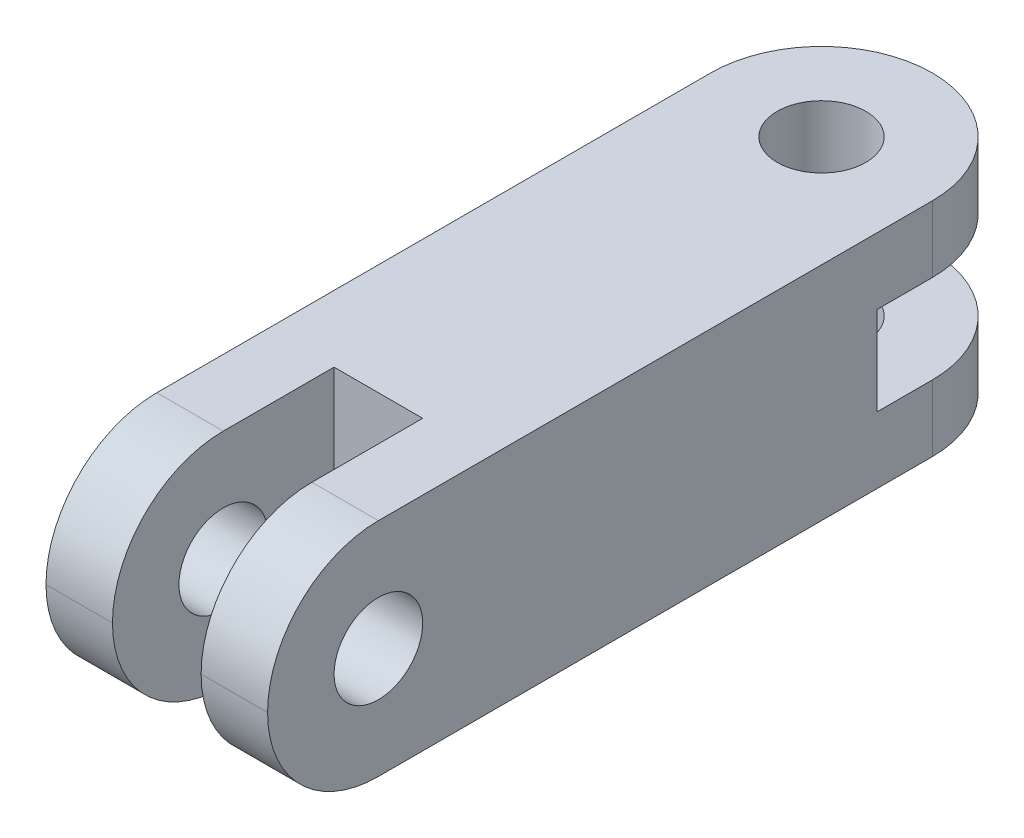
ISO-10303-21;
HEADER;
FILE_DESCRIPTION(('STEP AP214'),'2;1');
FILE_NAME('part.step','',(''),(''),'','','');
FILE_SCHEMA(('AUTOMOTIVE_DESIGN { 1 0 10303 214 1 1 1 1 }'));
ENDSEC;
DATA;
#1=APPLICATION_CONTEXT('core data for automotive mechanical design processes');
#2=APPLICATION_PROTOCOL_DEFINITION('international standard','automotive_design',2000,#1);
#3=PRODUCT_CONTEXT('',#1,'mechanical');
#4=PRODUCT('Part','Part','',(#3));
#5=PRODUCT_RELATED_PRODUCT_CATEGORY('part','',(#4));
#6=PRODUCT_DEFINITION_FORMATION('','',#4);
#7=PRODUCT_DEFINITION_CONTEXT('part definition',#1,'design');
#8=PRODUCT_DEFINITION('design','',#6,#7);
#9=PRODUCT_DEFINITION_SHAPE('','',#8);
#10=(LENGTH_UNIT() NAMED_UNIT(*) SI_UNIT(.MILLI.,.METRE.));
#11=(NAMED_UNIT(*) PLANE_ANGLE_UNIT() SI_UNIT($,.RADIAN.));
#12=(NAMED_UNIT(*) SI_UNIT($,.STERADIAN.) SOLID_ANGLE_UNIT());
#13=UNCERTAINTY_MEASURE_WITH_UNIT(LENGTH_MEASURE(1.E-05),#10,'distance_accuracy_value','');
#14=(GEOMETRIC_REPRESENTATION_CONTEXT(3) GLOBAL_UNCERTAINTY_ASSIGNED_CONTEXT((#13)) GLOBAL_UNIT_ASSIGNED_CONTEXT((#10,
#11,#12)) REPRESENTATION_CONTEXT('',''));
#15=CARTESIAN_POINT('',(0.,0.,0.));
#16=DIRECTION('',(0.,0.,1.));
#17=DIRECTION('',(1.,0.,0.));
#18=AXIS2_PLACEMENT_3D('',#15,#16,#17);
#19=CARTESIAN_POINT('',(25.,0.,0.));
#20=DIRECTION('',(1.,0.,0.));
#21=DIRECTION('',(0.,0.,-1.));
#22=AXIS2_PLACEMENT_3D('',#19,#20,#21);
#23=PLANE('',#22);
#24=DIRECTION('',(0.,0.,1.));
#25=VECTOR('',#24,1.);
#26=CARTESIAN_POINT('',(25.,10.,0.));
#27=LINE('',#26,#25);
#28=CARTESIAN_POINT('',(25.,10.,-62.5));
#29=VERTEX_POINT('',#28);
#30=CARTESIAN_POINT('',(25.,10.,-50.));
#31=VERTEX_POINT('',#30);
#32=EDGE_CURVE('E248',#29,#31,#27,.T.);
#33=ORIENTED_EDGE('',*,*,#32,.F.);
#34=DIRECTION('',(0.,1.,0.));
#35=VECTOR('',#34,1.);
#36=CARTESIAN_POINT('',(25.,0.,-62.5));
#37=LINE('',#36,#35);
#38=CARTESIAN_POINT('',(25.,25.,-62.5));
#39=VERTEX_POINT('',#38);
#40=EDGE_CURVE('E257',#29,#39,#37,.T.);
#41=ORIENTED_EDGE('',*,*,#40,.T.);
#42=DIRECTION('',(0.,0.,1.));
#43=VECTOR('',#42,1.);
#44=CARTESIAN_POINT('',(25.,25.,-87.5));
#45=LINE('',#44,#43);
#46=CARTESIAN_POINT('',(25.,25.,62.5));
#47=VERTEX_POINT('',#46);
#48=EDGE_CURVE('E210',#39,#47,#45,.T.);
#49=ORIENTED_EDGE('',*,*,#48,.T.);
#50=CARTESIAN_POINT('',(25.,0.,62.5));
#51=DIRECTION('',(1.,0.,0.));
#52=DIRECTION('',(0.,0.,-1.));
#53=AXIS2_PLACEMENT_3D('',#50,#51,#52);
#54=CIRCLE('',#53,25.);
#55=CARTESIAN_POINT('',(25.,0.,87.5));
#56=VERTEX_POINT('',#55);
#57=EDGE_CURVE('E238',#47,#56,#54,.T.);
#58=ORIENTED_EDGE('',*,*,#57,.T.);
#59=CARTESIAN_POINT('',(25.,0.,62.5));
#60=DIRECTION('',(1.,0.,0.));
#61=DIRECTION('',(0.,0.,-1.));
#62=AXIS2_PLACEMENT_3D('',#59,#60,#61);
#63=CIRCLE('',#62,25.);
#64=CARTESIAN_POINT('',(25.,-25.,62.5));
#65=VERTEX_POINT('',#64);
#66=EDGE_CURVE('E236',#56,#65,#63,.T.);
#67=ORIENTED_EDGE('',*,*,#66,.T.);
#68=DIRECTION('',(0.,0.,-1.));
#69=VECTOR('',#68,1.);
#70=CARTESIAN_POINT('',(25.,-25.,87.5));
#71=LINE('',#70,#69);
#72=CARTESIAN_POINT('',(25.,-25.,-62.5));
#73=VERTEX_POINT('',#72);
#74=EDGE_CURVE('E214',#65,#73,#71,.T.);
#75=ORIENTED_EDGE('',*,*,#74,.T.);
#76=DIRECTION('',(0.,1.,0.));
#77=VECTOR('',#76,1.);
#78=CARTESIAN_POINT('',(25.,0.,-62.5));
#79=LINE('',#78,#77);
#80=CARTESIAN_POINT('',(25.,-10.,-62.5));
#81=VERTEX_POINT('',#80);
#82=EDGE_CURVE('E254',#73,#81,#79,.T.);
#83=ORIENTED_EDGE('',*,*,#82,.T.);
#84=DIRECTION('',(0.,0.,-1.));
#85=VECTOR('',#84,1.);
#86=CARTESIAN_POINT('',(25.,-10.,-50.));
#87=LINE('',#86,#85);
#88=CARTESIAN_POINT('',(25.,-10.,-50.));
#89=VERTEX_POINT('',#88);
#90=EDGE_CURVE('E178',#89,#81,#87,.T.);
#91=ORIENTED_EDGE('',*,*,#90,.F.);
#92=DIRECTION('',(0.,-1.,0.));
#93=VECTOR('',#92,1.);
#94=CARTESIAN_POINT('',(25.,10.,-50.));
#95=LINE('',#94,#93);
#96=EDGE_CURVE('E163',#31,#89,#95,.T.);
#97=ORIENTED_EDGE('',*,*,#96,.F.);
#98=EDGE_LOOP('',(#33,#41,#49,#58,#67,#75,#83,#91,#97));
#99=FACE_BOUND('',#98,.T.);
#100=CARTESIAN_POINT('',(25.,0.,62.5));
#101=DIRECTION('',(-1.,0.,0.));
#102=DIRECTION('',(0.,0.,1.));
#103=AXIS2_PLACEMENT_3D('',#100,#101,#102);
#104=CIRCLE('',#103,10.);
#105=CARTESIAN_POINT('',(25.,0.,72.5));
#106=VERTEX_POINT('',#105);
#107=EDGE_CURVE('E297',#106,#106,#104,.T.);
#108=ORIENTED_EDGE('',*,*,#107,.T.);
#109=EDGE_LOOP('',(#108));
#110=FACE_BOUND('',#109,.T.);
#111=ADVANCED_FACE('F41',(#99,#110),#23,.T.);
#112=CARTESIAN_POINT('',(-25.,25.,-87.5));
#113=DIRECTION('',(0.,1.,0.));
#114=DIRECTION('',(0.,0.,1.));
#115=AXIS2_PLACEMENT_3D('',#112,#113,#114);
#116=PLANE('',#115);
#117=CARTESIAN_POINT('',(0.,25.,-62.5));
#118=DIRECTION('',(0.,1.,0.));
#119=DIRECTION('',(0.,0.,1.));
#120=AXIS2_PLACEMENT_3D('',#117,#118,#119);
#121=CIRCLE('',#120,10.);
#122=CARTESIAN_POINT('',(0.,25.,-52.5));
#123=VERTEX_POINT('',#122);
#124=EDGE_CURVE('E289',#123,#123,#121,.T.);
#125=ORIENTED_EDGE('',*,*,#124,.F.);
#126=EDGE_LOOP('',(#125));
#127=FACE_BOUND('',#126,.T.);
#128=ORIENTED_EDGE('',*,*,#48,.F.);
#129=CARTESIAN_POINT('',(0.,25.,-62.5));
#130=DIRECTION('',(0.,1.,0.));
#131=DIRECTION('',(0.,0.,1.));
#132=AXIS2_PLACEMENT_3D('',#129,#130,#131);
#133=CIRCLE('',#132,25.);
#134=CARTESIAN_POINT('',(0.,25.,-87.5));
#135=VERTEX_POINT('',#134);
#136=EDGE_CURVE('E262',#39,#135,#133,.T.);
#137=ORIENTED_EDGE('',*,*,#136,.T.);
#138=CARTESIAN_POINT('',(0.,25.,-62.5));
#139=DIRECTION('',(0.,1.,0.));
#140=DIRECTION('',(0.,0.,1.));
#141=AXIS2_PLACEMENT_3D('',#138,#139,#140);
#142=CIRCLE('',#141,25.);
#143=CARTESIAN_POINT('',(-25.,25.,-62.5));
#144=VERTEX_POINT('',#143);
#145=EDGE_CURVE('E260',#135,#144,#142,.T.);
#146=ORIENTED_EDGE('',*,*,#145,.T.);
#147=DIRECTION('',(0.,0.,1.));
#148=VECTOR('',#147,1.);
#149=CARTESIAN_POINT('',(-25.,25.,-87.5));
#150=LINE('',#149,#148);
#151=CARTESIAN_POINT('',(-25.,25.,62.5));
#152=VERTEX_POINT('',#151);
#153=EDGE_CURVE('E217',#144,#152,#150,.T.);
#154=ORIENTED_EDGE('',*,*,#153,.T.);
#155=DIRECTION('',(1.,0.,0.));
#156=VECTOR('',#155,1.);
#157=CARTESIAN_POINT('',(-25.,25.,62.5));
#158=LINE('',#157,#156);
#159=CARTESIAN_POINT('',(-10.,25.,62.5));
#160=VERTEX_POINT('',#159);
#161=EDGE_CURVE('E224',#152,#160,#158,.T.);
#162=ORIENTED_EDGE('',*,*,#161,.T.);
#163=DIRECTION('',(0.,0.,1.));
#164=VECTOR('',#163,1.);
#165=CARTESIAN_POINT('',(-10.,25.,87.5));
#166=LINE('',#165,#164);
#167=CARTESIAN_POINT('',(-10.,25.,37.5));
#168=VERTEX_POINT('',#167);
#169=EDGE_CURVE('E200',#168,#160,#166,.T.);
#170=ORIENTED_EDGE('',*,*,#169,.F.);
#171=DIRECTION('',(-1.,0.,0.));
#172=VECTOR('',#171,1.);
#173=CARTESIAN_POINT('',(-10.,25.,37.5));
#174=LINE('',#173,#172);
#175=CARTESIAN_POINT('',(10.,25.,37.5));
#176=VERTEX_POINT('',#175);
#177=EDGE_CURVE('E194',#176,#168,#174,.T.);
#178=ORIENTED_EDGE('',*,*,#177,.F.);
#179=DIRECTION('',(0.,0.,-1.));
#180=VECTOR('',#179,1.);
#181=CARTESIAN_POINT('',(10.,25.,87.5));
#182=LINE('',#181,#180);
#183=CARTESIAN_POINT('',(10.,25.,62.5));
#184=VERTEX_POINT('',#183);
#185=EDGE_CURVE('E203',#184,#176,#182,.T.);
#186=ORIENTED_EDGE('',*,*,#185,.F.);
#187=DIRECTION('',(1.,0.,0.));
#188=VECTOR('',#187,1.);
#189=CARTESIAN_POINT('',(-25.,25.,62.5));
#190=LINE('',#189,#188);
#191=EDGE_CURVE('E221',#184,#47,#190,.T.);
#192=ORIENTED_EDGE('',*,*,#191,.T.);
#193=EDGE_LOOP('',(#128,#137,#146,#154,#162,#170,#178,#186,#192));
#194=FACE_BOUND('',#193,.T.);
#195=ADVANCED_FACE('F319',(#127,#194),#116,.T.);
#196=CARTESIAN_POINT('',(-25.,-25.,87.5));
#197=DIRECTION('',(0.,-1.,0.));
#198=DIRECTION('',(0.,0.,-1.));
#199=AXIS2_PLACEMENT_3D('',#196,#197,#198);
#200=PLANE('',#199);
#201=CARTESIAN_POINT('',(0.,-25.,-62.5));
#202=DIRECTION('',(0.,1.,0.));
#203=DIRECTION('',(0.,0.,1.));
#204=AXIS2_PLACEMENT_3D('',#201,#202,#203);
#205=CIRCLE('',#204,10.);
#206=CARTESIAN_POINT('',(0.,-25.,-52.5));
#207=VERTEX_POINT('',#206);
#208=EDGE_CURVE('E285',#207,#207,#205,.T.);
#209=ORIENTED_EDGE('',*,*,#208,.T.);
#210=EDGE_LOOP('',(#209));
#211=FACE_BOUND('',#210,.T.);
#212=CARTESIAN_POINT('',(0.,-25.,-62.5));
#213=DIRECTION('',(0.,-1.,0.));
#214=DIRECTION('',(0.,0.,-1.));
#215=AXIS2_PLACEMENT_3D('',#212,#213,#214);
#216=CIRCLE('',#215,25.);
#217=CARTESIAN_POINT('',(-25.,-25.,-62.5));
#218=VERTEX_POINT('',#217);
#219=CARTESIAN_POINT('',(0.,-25.,-87.5));
#220=VERTEX_POINT('',#219);
#221=EDGE_CURVE('E58',#218,#220,#216,.T.);
#222=ORIENTED_EDGE('',*,*,#221,.T.);
#223=CARTESIAN_POINT('',(0.,-25.,-62.5));
#224=DIRECTION('',(0.,-1.,0.));
#225=DIRECTION('',(0.,0.,-1.));
#226=AXIS2_PLACEMENT_3D('',#223,#224,#225);
#227=CIRCLE('',#226,25.);
#228=EDGE_CURVE('E272',#220,#73,#227,.T.);
#229=ORIENTED_EDGE('',*,*,#228,.T.);
#230=ORIENTED_EDGE('',*,*,#74,.F.);
#231=DIRECTION('',(1.,0.,0.));
#232=VECTOR('',#231,1.);
#233=CARTESIAN_POINT('',(-25.,-25.,62.5));
#234=LINE('',#233,#232);
#235=CARTESIAN_POINT('',(10.,-25.,62.5));
#236=VERTEX_POINT('',#235);
#237=EDGE_CURVE('E244',#65,#236,#234,.F.);
#238=ORIENTED_EDGE('',*,*,#237,.T.);
#239=DIRECTION('',(0.,0.,-1.));
#240=VECTOR('',#239,1.);
#241=CARTESIAN_POINT('',(10.,-25.,87.5));
#242=LINE('',#241,#240);
#243=CARTESIAN_POINT('',(10.,-25.,37.5));
#244=VERTEX_POINT('',#243);
#245=EDGE_CURVE('E193',#236,#244,#242,.T.);
#246=ORIENTED_EDGE('',*,*,#245,.T.);
#247=DIRECTION('',(-1.,0.,0.));
#248=VECTOR('',#247,1.);
#249=CARTESIAN_POINT('',(-10.,-25.,37.5));
#250=LINE('',#249,#248);
#251=CARTESIAN_POINT('',(-10.,-25.,37.5));
#252=VERTEX_POINT('',#251);
#253=EDGE_CURVE('E196',#244,#252,#250,.T.);
#254=ORIENTED_EDGE('',*,*,#253,.T.);
#255=DIRECTION('',(0.,0.,1.));
#256=VECTOR('',#255,1.);
#257=CARTESIAN_POINT('',(-10.,-25.,87.5));
#258=LINE('',#257,#256);
#259=CARTESIAN_POINT('',(-10.,-25.,62.5));
#260=VERTEX_POINT('',#259);
#261=EDGE_CURVE('E190',#252,#260,#258,.T.);
#262=ORIENTED_EDGE('',*,*,#261,.T.);
#263=DIRECTION('',(1.,0.,0.));
#264=VECTOR('',#263,1.);
#265=CARTESIAN_POINT('',(-25.,-25.,62.5));
#266=LINE('',#265,#264);
#267=CARTESIAN_POINT('',(-25.,-25.,62.5));
#268=VERTEX_POINT('',#267);
#269=EDGE_CURVE('E246',#260,#268,#266,.F.);
#270=ORIENTED_EDGE('',*,*,#269,.T.);
#271=DIRECTION('',(0.,0.,-1.));
#272=VECTOR('',#271,1.);
#273=CARTESIAN_POINT('',(-25.,-25.,87.5));
#274=LINE('',#273,#272);
#275=EDGE_CURVE('E219',#268,#218,#274,.T.);
#276=ORIENTED_EDGE('',*,*,#275,.T.);
#277=EDGE_LOOP('',(#222,#229,#230,#238,#246,#254,#262,#270,#276));
#278=FACE_BOUND('',#277,.T.);
#279=ADVANCED_FACE('F309',(#211,#278),#200,.T.);
#280=CARTESIAN_POINT('',(-25.,0.,0.));
#281=DIRECTION('',(1.,0.,0.));
#282=DIRECTION('',(0.,0.,-1.));
#283=AXIS2_PLACEMENT_3D('',#280,#281,#282);
#284=PLANE('',#283);
#285=CARTESIAN_POINT('',(-25.,0.,62.5));
#286=DIRECTION('',(-1.,0.,0.));
#287=DIRECTION('',(0.,0.,1.));
#288=AXIS2_PLACEMENT_3D('',#285,#286,#287);
#289=CIRCLE('',#288,10.);
#290=CARTESIAN_POINT('',(-25.,0.,72.5));
#291=VERTEX_POINT('',#290);
#292=EDGE_CURVE('E300',#291,#291,#289,.T.);
#293=ORIENTED_EDGE('',*,*,#292,.F.);
#294=EDGE_LOOP('',(#293));
#295=FACE_BOUND('',#294,.T.);
#296=DIRECTION('',(0.,0.,-1.));
#297=VECTOR('',#296,1.);
#298=CARTESIAN_POINT('',(-25.,-10.,-50.));
#299=LINE('',#298,#297);
#300=CARTESIAN_POINT('',(-25.,-10.,-50.));
#301=VERTEX_POINT('',#300);
#302=CARTESIAN_POINT('',(-25.,-10.,-62.5));
#303=VERTEX_POINT('',#302);
#304=EDGE_CURVE('E170',#301,#303,#299,.T.);
#305=ORIENTED_EDGE('',*,*,#304,.T.);
#306=DIRECTION('',(0.,1.,0.));
#307=VECTOR('',#306,1.);
#308=CARTESIAN_POINT('',(-25.,-25.,-62.5));
#309=LINE('',#308,#307);
#310=EDGE_CURVE('E11',#303,#218,#309,.F.);
#311=ORIENTED_EDGE('',*,*,#310,.T.);
#312=ORIENTED_EDGE('',*,*,#275,.F.);
#313=CARTESIAN_POINT('',(-25.,0.,62.5));
#314=DIRECTION('',(1.,0.,0.));
#315=DIRECTION('',(0.,0.,-1.));
#316=AXIS2_PLACEMENT_3D('',#313,#314,#315);
#317=CIRCLE('',#316,25.);
#318=CARTESIAN_POINT('',(-25.,0.,87.5));
#319=VERTEX_POINT('',#318);
#320=EDGE_CURVE('E231',#268,#319,#317,.F.);
#321=ORIENTED_EDGE('',*,*,#320,.T.);
#322=CARTESIAN_POINT('',(-25.,0.,62.5));
#323=DIRECTION('',(1.,0.,0.));
#324=DIRECTION('',(0.,0.,-1.));
#325=AXIS2_PLACEMENT_3D('',#322,#323,#324);
#326=CIRCLE('',#325,25.);
#327=EDGE_CURVE('E233',#319,#152,#326,.F.);
#328=ORIENTED_EDGE('',*,*,#327,.T.);
#329=ORIENTED_EDGE('',*,*,#153,.F.);
#330=DIRECTION('',(0.,1.,0.));
#331=VECTOR('',#330,1.);
#332=CARTESIAN_POINT('',(-25.,10.,-62.5));
#333=LINE('',#332,#331);
#334=CARTESIAN_POINT('',(-25.,10.,-62.5));
#335=VERTEX_POINT('',#334);
#336=EDGE_CURVE('E50',#144,#335,#333,.F.);
#337=ORIENTED_EDGE('',*,*,#336,.T.);
#338=DIRECTION('',(0.,0.,1.));
#339=VECTOR('',#338,1.);
#340=CARTESIAN_POINT('',(-25.,10.,-50.));
#341=LINE('',#340,#339);
#342=CARTESIAN_POINT('',(-25.,10.,-50.));
#343=VERTEX_POINT('',#342);
#344=EDGE_CURVE('E168',#335,#343,#341,.T.);
#345=ORIENTED_EDGE('',*,*,#344,.T.);
#346=DIRECTION('',(0.,-1.,0.));
#347=VECTOR('',#346,1.);
#348=CARTESIAN_POINT('',(-25.,10.,-50.));
#349=LINE('',#348,#347);
#350=EDGE_CURVE('E161',#343,#301,#349,.T.);
#351=ORIENTED_EDGE('',*,*,#350,.T.);
#352=EDGE_LOOP('',(#305,#311,#312,#321,#328,#329,#337,#345,#351));
#353=FACE_BOUND('',#352,.T.);
#354=ADVANCED_FACE('F175',(#295,#353),#284,.F.);
#355=CARTESIAN_POINT('',(-10.,-25.,87.5));
#356=DIRECTION('',(-1.,0.,0.));
#357=DIRECTION('',(0.,0.,1.));
#358=AXIS2_PLACEMENT_3D('',#355,#356,#357);
#359=PLANE('',#358);
#360=CARTESIAN_POINT('',(-10.,0.,62.5));
#361=DIRECTION('',(-1.,0.,0.));
#362=DIRECTION('',(0.,0.,1.));
#363=AXIS2_PLACEMENT_3D('',#360,#361,#362);
#364=CIRCLE('',#363,10.);
#365=CARTESIAN_POINT('',(-10.,0.,72.5));
#366=VERTEX_POINT('',#365);
#367=EDGE_CURVE('E294',#366,#366,#364,.T.);
#368=ORIENTED_EDGE('',*,*,#367,.T.);
#369=EDGE_LOOP('',(#368));
#370=FACE_BOUND('',#369,.T.);
#371=ORIENTED_EDGE('',*,*,#169,.T.);
#372=CARTESIAN_POINT('',(-10.,0.,62.5));
#373=DIRECTION('',(-1.,0.,0.));
#374=DIRECTION('',(0.,0.,1.));
#375=AXIS2_PLACEMENT_3D('',#372,#373,#374);
#376=CIRCLE('',#375,25.);
#377=CARTESIAN_POINT('',(-10.,0.,87.5));
#378=VERTEX_POINT('',#377);
#379=EDGE_CURVE('E229',#160,#378,#376,.F.);
#380=ORIENTED_EDGE('',*,*,#379,.T.);
#381=CARTESIAN_POINT('',(-10.,0.,62.5));
#382=DIRECTION('',(-1.,0.,0.));
#383=DIRECTION('',(0.,0.,1.));
#384=AXIS2_PLACEMENT_3D('',#381,#382,#383);
#385=CIRCLE('',#384,25.);
#386=EDGE_CURVE('E227',#378,#260,#385,.F.);
#387=ORIENTED_EDGE('',*,*,#386,.T.);
#388=ORIENTED_EDGE('',*,*,#261,.F.);
#389=DIRECTION('',(0.,1.,0.));
#390=VECTOR('',#389,1.);
#391=CARTESIAN_POINT('',(-10.,-25.,37.5));
#392=LINE('',#391,#390);
#393=EDGE_CURVE('E208',#252,#168,#392,.T.);
#394=ORIENTED_EDGE('',*,*,#393,.T.);
#395=EDGE_LOOP('',(#371,#380,#387,#388,#394));
#396=FACE_BOUND('',#395,.T.);
#397=ADVANCED_FACE('F308',(#370,#396),#359,.F.);
#398=CARTESIAN_POINT('',(-10.,-25.,37.5));
#399=DIRECTION('',(0.,0.,-1.));
#400=DIRECTION('',(0.,1.,0.));
#401=AXIS2_PLACEMENT_3D('',#398,#399,#400);
#402=PLANE('',#401);
#403=ORIENTED_EDGE('',*,*,#177,.T.);
#404=ORIENTED_EDGE('',*,*,#393,.F.);
#405=ORIENTED_EDGE('',*,*,#253,.F.);
#406=DIRECTION('',(0.,1.,0.));
#407=VECTOR('',#406,1.);
#408=CARTESIAN_POINT('',(10.,-25.,37.5));
#409=LINE('',#408,#407);
#410=EDGE_CURVE('E199',#244,#176,#409,.T.);
#411=ORIENTED_EDGE('',*,*,#410,.T.);
#412=EDGE_LOOP('',(#403,#404,#405,#411));
#413=FACE_BOUND('',#412,.T.);
#414=ADVANCED_FACE('F315',(#413),#402,.F.);
#415=CARTESIAN_POINT('',(10.,-25.,87.5));
#416=DIRECTION('',(1.,0.,0.));
#417=DIRECTION('',(0.,0.,-1.));
#418=AXIS2_PLACEMENT_3D('',#415,#416,#417);
#419=PLANE('',#418);
#420=CARTESIAN_POINT('',(10.,0.,62.5));
#421=DIRECTION('',(1.,0.,0.));
#422=DIRECTION('',(0.,0.,-1.));
#423=AXIS2_PLACEMENT_3D('',#420,#421,#422);
#424=CIRCLE('',#423,10.);
#425=CARTESIAN_POINT('',(10.,0.,52.5));
#426=VERTEX_POINT('',#425);
#427=EDGE_CURVE('E45',#426,#426,#424,.T.);
#428=ORIENTED_EDGE('',*,*,#427,.T.);
#429=EDGE_LOOP('',(#428));
#430=FACE_BOUND('',#429,.T.);
#431=CARTESIAN_POINT('',(10.,0.,62.5));
#432=DIRECTION('',(1.,0.,0.));
#433=DIRECTION('',(0.,0.,-1.));
#434=AXIS2_PLACEMENT_3D('',#431,#432,#433);
#435=CIRCLE('',#434,25.);
#436=CARTESIAN_POINT('',(10.,0.,87.5));
#437=VERTEX_POINT('',#436);
#438=EDGE_CURVE('E240',#236,#437,#435,.F.);
#439=ORIENTED_EDGE('',*,*,#438,.T.);
#440=CARTESIAN_POINT('',(10.,0.,62.5));
#441=DIRECTION('',(1.,0.,0.));
#442=DIRECTION('',(0.,0.,-1.));
#443=AXIS2_PLACEMENT_3D('',#440,#441,#442);
#444=CIRCLE('',#443,25.);
#445=EDGE_CURVE('E242',#437,#184,#444,.F.);
#446=ORIENTED_EDGE('',*,*,#445,.T.);
#447=ORIENTED_EDGE('',*,*,#185,.T.);
#448=ORIENTED_EDGE('',*,*,#410,.F.);
#449=ORIENTED_EDGE('',*,*,#245,.F.);
#450=EDGE_LOOP('',(#439,#446,#447,#448,#449));
#451=FACE_BOUND('',#450,.T.);
#452=ADVANCED_FACE('F333',(#430,#451),#419,.F.);
#453=CARTESIAN_POINT('',(-25.,0.,62.5));
#454=DIRECTION('',(1.,0.,0.));
#455=DIRECTION('',(0.,0.,-1.));
#456=AXIS2_PLACEMENT_3D('',#453,#454,#455);
#457=CYLINDRICAL_SURFACE('',#456,25.);
#458=DIRECTION('',(1.,0.,0.));
#459=VECTOR('',#458,1.);
#460=CARTESIAN_POINT('',(-25.,0.,87.5));
#461=LINE('',#460,#459);
#462=EDGE_CURVE('E204',#319,#378,#461,.T.);
#463=ORIENTED_EDGE('',*,*,#462,.F.);
#464=ORIENTED_EDGE('',*,*,#320,.F.);
#465=ORIENTED_EDGE('',*,*,#269,.F.);
#466=ORIENTED_EDGE('',*,*,#386,.F.);
#467=EDGE_LOOP('',(#463,#464,#465,#466));
#468=FACE_BOUND('',#467,.T.);
#469=ADVANCED_FACE('F336',(#468),#457,.T.);
#470=CARTESIAN_POINT('',(-25.,0.,62.5));
#471=DIRECTION('',(1.,0.,0.));
#472=DIRECTION('',(0.,0.,-1.));
#473=AXIS2_PLACEMENT_3D('',#470,#471,#472);
#474=CYLINDRICAL_SURFACE('',#473,25.);
#475=ORIENTED_EDGE('',*,*,#327,.F.);
#476=ORIENTED_EDGE('',*,*,#462,.T.);
#477=ORIENTED_EDGE('',*,*,#379,.F.);
#478=ORIENTED_EDGE('',*,*,#161,.F.);
#479=EDGE_LOOP('',(#475,#476,#477,#478));
#480=FACE_BOUND('',#479,.T.);
#481=ADVANCED_FACE('F408',(#480),#474,.T.);
#482=CARTESIAN_POINT('',(-25.,0.,62.5));
#483=DIRECTION('',(1.,0.,0.));
#484=DIRECTION('',(0.,0.,-1.));
#485=AXIS2_PLACEMENT_3D('',#482,#483,#484);
#486=CYLINDRICAL_SURFACE('',#485,25.);
#487=DIRECTION('',(1.,0.,0.));
#488=VECTOR('',#487,1.);
#489=CARTESIAN_POINT('',(-25.,0.,87.5));
#490=LINE('',#489,#488);
#491=EDGE_CURVE('E188',#437,#56,#490,.T.);
#492=ORIENTED_EDGE('',*,*,#491,.F.);
#493=ORIENTED_EDGE('',*,*,#438,.F.);
#494=ORIENTED_EDGE('',*,*,#237,.F.);
#495=ORIENTED_EDGE('',*,*,#66,.F.);
#496=EDGE_LOOP('',(#492,#493,#494,#495));
#497=FACE_BOUND('',#496,.T.);
#498=ADVANCED_FACE('F376',(#497),#486,.T.);
#499=CARTESIAN_POINT('',(-25.,0.,62.5));
#500=DIRECTION('',(1.,0.,0.));
#501=DIRECTION('',(0.,0.,-1.));
#502=AXIS2_PLACEMENT_3D('',#499,#500,#501);
#503=CYLINDRICAL_SURFACE('',#502,25.);
#504=ORIENTED_EDGE('',*,*,#445,.F.);
#505=ORIENTED_EDGE('',*,*,#491,.T.);
#506=ORIENTED_EDGE('',*,*,#57,.F.);
#507=ORIENTED_EDGE('',*,*,#191,.F.);
#508=EDGE_LOOP('',(#504,#505,#506,#507));
#509=FACE_BOUND('',#508,.T.);
#510=ADVANCED_FACE('F344',(#509),#503,.T.);
#511=CARTESIAN_POINT('',(-25.,10.,-50.));
#512=DIRECTION('',(0.,0.,1.));
#513=DIRECTION('',(1.,0.,0.));
#514=AXIS2_PLACEMENT_3D('',#511,#512,#513);
#515=PLANE('',#514);
#516=ORIENTED_EDGE('',*,*,#96,.T.);
#517=DIRECTION('',(1.,0.,0.));
#518=VECTOR('',#517,1.);
#519=CARTESIAN_POINT('',(-25.,-10.,-50.));
#520=LINE('',#519,#518);
#521=EDGE_CURVE('E156',#301,#89,#520,.T.);
#522=ORIENTED_EDGE('',*,*,#521,.F.);
#523=ORIENTED_EDGE('',*,*,#350,.F.);
#524=DIRECTION('',(1.,0.,0.));
#525=VECTOR('',#524,1.);
#526=CARTESIAN_POINT('',(-25.,10.,-50.));
#527=LINE('',#526,#525);
#528=EDGE_CURVE('E167',#343,#31,#527,.T.);
#529=ORIENTED_EDGE('',*,*,#528,.T.);
#530=EDGE_LOOP('',(#516,#522,#523,#529));
#531=FACE_BOUND('',#530,.T.);
#532=ADVANCED_FACE('F158',(#531),#515,.F.);
#533=CARTESIAN_POINT('',(-25.,10.,-50.));
#534=DIRECTION('',(0.,1.,0.));
#535=DIRECTION('',(0.,0.,1.));
#536=AXIS2_PLACEMENT_3D('',#533,#534,#535);
#537=PLANE('',#536);
#538=CARTESIAN_POINT('',(0.,10.,-62.5));
#539=DIRECTION('',(0.,1.,0.));
#540=DIRECTION('',(0.,0.,1.));
#541=AXIS2_PLACEMENT_3D('',#538,#539,#540);
#542=CIRCLE('',#541,10.);
#543=CARTESIAN_POINT('',(0.,10.,-52.5));
#544=VERTEX_POINT('',#543);
#545=EDGE_CURVE('E182',#544,#544,#542,.T.);
#546=ORIENTED_EDGE('',*,*,#545,.T.);
#547=EDGE_LOOP('',(#546));
#548=FACE_BOUND('',#547,.T.);
#549=CARTESIAN_POINT('',(0.,10.,-62.5));
#550=DIRECTION('',(0.,1.,0.));
#551=DIRECTION('',(0.,0.,1.));
#552=AXIS2_PLACEMENT_3D('',#549,#550,#551);
#553=CIRCLE('',#552,25.);
#554=CARTESIAN_POINT('',(0.,10.,-87.5));
#555=VERTEX_POINT('',#554);
#556=EDGE_CURVE('E264',#335,#555,#553,.F.);
#557=ORIENTED_EDGE('',*,*,#556,.T.);
#558=CARTESIAN_POINT('',(0.,10.,-62.5));
#559=DIRECTION('',(0.,1.,0.));
#560=DIRECTION('',(0.,0.,1.));
#561=AXIS2_PLACEMENT_3D('',#558,#559,#560);
#562=CIRCLE('',#561,25.);
#563=EDGE_CURVE('E266',#555,#29,#562,.F.);
#564=ORIENTED_EDGE('',*,*,#563,.T.);
#565=ORIENTED_EDGE('',*,*,#32,.T.);
#566=ORIENTED_EDGE('',*,*,#528,.F.);
#567=ORIENTED_EDGE('',*,*,#344,.F.);
#568=EDGE_LOOP('',(#557,#564,#565,#566,#567));
#569=FACE_BOUND('',#568,.T.);
#570=ADVANCED_FACE('F343',(#548,#569),#537,.F.);
#571=CARTESIAN_POINT('',(-25.,-10.,-50.));
#572=DIRECTION('',(0.,-1.,0.));
#573=DIRECTION('',(0.,0.,-1.));
#574=AXIS2_PLACEMENT_3D('',#571,#572,#573);
#575=PLANE('',#574);
#576=CARTESIAN_POINT('',(0.,-10.,-62.5));
#577=DIRECTION('',(0.,-1.,0.));
#578=DIRECTION('',(0.,0.,-1.));
#579=AXIS2_PLACEMENT_3D('',#576,#577,#578);
#580=CIRCLE('',#579,10.);
#581=CARTESIAN_POINT('',(0.,-10.,-72.5));
#582=VERTEX_POINT('',#581);
#583=EDGE_CURVE('E281',#582,#582,#580,.T.);
#584=ORIENTED_EDGE('',*,*,#583,.T.);
#585=EDGE_LOOP('',(#584));
#586=FACE_BOUND('',#585,.T.);
#587=ORIENTED_EDGE('',*,*,#90,.T.);
#588=CARTESIAN_POINT('',(0.,-10.,-62.5));
#589=DIRECTION('',(0.,-1.,0.));
#590=DIRECTION('',(0.,0.,-1.));
#591=AXIS2_PLACEMENT_3D('',#588,#589,#590);
#592=CIRCLE('',#591,25.);
#593=CARTESIAN_POINT('',(0.,-10.,-87.5));
#594=VERTEX_POINT('',#593);
#595=EDGE_CURVE('E269',#81,#594,#592,.F.);
#596=ORIENTED_EDGE('',*,*,#595,.T.);
#597=CARTESIAN_POINT('',(0.,-10.,-62.5));
#598=DIRECTION('',(0.,-1.,0.));
#599=DIRECTION('',(0.,0.,-1.));
#600=AXIS2_PLACEMENT_3D('',#597,#598,#599);
#601=CIRCLE('',#600,25.);
#602=EDGE_CURVE('E173',#594,#303,#601,.F.);
#603=ORIENTED_EDGE('',*,*,#602,.T.);
#604=ORIENTED_EDGE('',*,*,#304,.F.);
#605=ORIENTED_EDGE('',*,*,#521,.T.);
#606=EDGE_LOOP('',(#587,#596,#603,#604,#605));
#607=FACE_BOUND('',#606,.T.);
#608=ADVANCED_FACE('F171',(#586,#607),#575,.F.);
#609=CARTESIAN_POINT('',(0.,25.,-62.5));
#610=DIRECTION('',(0.,-1.,0.));
#611=DIRECTION('',(0.,0.,-1.));
#612=AXIS2_PLACEMENT_3D('',#609,#610,#611);
#613=CYLINDRICAL_SURFACE('',#612,25.);
#614=DIRECTION('',(0.,1.,0.));
#615=VECTOR('',#614,1.);
#616=CARTESIAN_POINT('',(0.,25.,-87.5));
#617=LINE('',#616,#615);
#618=EDGE_CURVE('E186',#555,#135,#617,.T.);
#619=ORIENTED_EDGE('',*,*,#618,.F.);
#620=ORIENTED_EDGE('',*,*,#556,.F.);
#621=ORIENTED_EDGE('',*,*,#336,.F.);
#622=ORIENTED_EDGE('',*,*,#145,.F.);
#623=EDGE_LOOP('',(#619,#620,#621,#622));
#624=FACE_BOUND('',#623,.T.);
#625=ADVANCED_FACE('F347',(#624),#613,.T.);
#626=CARTESIAN_POINT('',(0.,0.,-62.5));
#627=DIRECTION('',(0.,1.,0.));
#628=DIRECTION('',(0.,0.,1.));
#629=AXIS2_PLACEMENT_3D('',#626,#627,#628);
#630=CYLINDRICAL_SURFACE('',#629,25.);
#631=ORIENTED_EDGE('',*,*,#563,.F.);
#632=ORIENTED_EDGE('',*,*,#618,.T.);
#633=ORIENTED_EDGE('',*,*,#136,.F.);
#634=ORIENTED_EDGE('',*,*,#40,.F.);
#635=EDGE_LOOP('',(#631,#632,#633,#634));
#636=FACE_BOUND('',#635,.T.);
#637=ADVANCED_FACE('F392',(#636),#630,.T.);
#638=CARTESIAN_POINT('',(0.,25.,-62.5));
#639=DIRECTION('',(0.,-1.,0.));
#640=DIRECTION('',(0.,0.,-1.));
#641=AXIS2_PLACEMENT_3D('',#638,#639,#640);
#642=CYLINDRICAL_SURFACE('',#641,25.);
#643=DIRECTION('',(0.,1.,0.));
#644=VECTOR('',#643,1.);
#645=CARTESIAN_POINT('',(0.,-10.,-87.5));
#646=LINE('',#645,#644);
#647=EDGE_CURVE('E276',#220,#594,#646,.T.);
#648=ORIENTED_EDGE('',*,*,#647,.F.);
#649=ORIENTED_EDGE('',*,*,#221,.F.);
#650=ORIENTED_EDGE('',*,*,#310,.F.);
#651=ORIENTED_EDGE('',*,*,#602,.F.);
#652=EDGE_LOOP('',(#648,#649,#650,#651));
#653=FACE_BOUND('',#652,.T.);
#654=ADVANCED_FACE('F43',(#653),#642,.T.);
#655=CARTESIAN_POINT('',(0.,0.,-62.5));
#656=DIRECTION('',(0.,1.,0.));
#657=DIRECTION('',(0.,0.,1.));
#658=AXIS2_PLACEMENT_3D('',#655,#656,#657);
#659=CYLINDRICAL_SURFACE('',#658,25.);
#660=ORIENTED_EDGE('',*,*,#228,.F.);
#661=ORIENTED_EDGE('',*,*,#647,.T.);
#662=ORIENTED_EDGE('',*,*,#595,.F.);
#663=ORIENTED_EDGE('',*,*,#82,.F.);
#664=EDGE_LOOP('',(#660,#661,#662,#663));
#665=FACE_BOUND('',#664,.T.);
#666=ADVANCED_FACE('F389',(#665),#659,.T.);
#667=CARTESIAN_POINT('',(0.,25.,-62.5));
#668=DIRECTION('',(0.,1.,0.));
#669=DIRECTION('',(0.,0.,1.));
#670=AXIS2_PLACEMENT_3D('',#667,#668,#669);
#671=CYLINDRICAL_SURFACE('',#670,10.);
#672=ORIENTED_EDGE('',*,*,#208,.F.);
#673=EDGE_LOOP('',(#672));
#674=FACE_BOUND('',#673,.T.);
#675=ORIENTED_EDGE('',*,*,#583,.F.);
#676=EDGE_LOOP('',(#675));
#677=FACE_BOUND('',#676,.T.);
#678=ADVANCED_FACE('F353',(#674,#677),#671,.F.);
#679=ORIENTED_EDGE('',*,*,#124,.T.);
#680=EDGE_LOOP('',(#679));
#681=FACE_BOUND('',#680,.T.);
#682=ORIENTED_EDGE('',*,*,#545,.F.);
#683=EDGE_LOOP('',(#682));
#684=FACE_BOUND('',#683,.T.);
#685=ADVANCED_FACE('F350',(#681,#684),#671,.F.);
#686=CARTESIAN_POINT('',(-25.,0.,62.5));
#687=DIRECTION('',(-1.,0.,0.));
#688=DIRECTION('',(0.,0.,1.));
#689=AXIS2_PLACEMENT_3D('',#686,#687,#688);
#690=CYLINDRICAL_SURFACE('',#689,10.);
#691=ORIENTED_EDGE('',*,*,#107,.F.);
#692=EDGE_LOOP('',(#691));
#693=FACE_BOUND('',#692,.T.);
#694=ORIENTED_EDGE('',*,*,#427,.F.);
#695=EDGE_LOOP('',(#694));
#696=FACE_BOUND('',#695,.T.);
#697=ADVANCED_FACE('F352',(#693,#696),#690,.F.);
#698=ORIENTED_EDGE('',*,*,#292,.T.);
#699=EDGE_LOOP('',(#698));
#700=FACE_BOUND('',#699,.T.);
#701=ORIENTED_EDGE('',*,*,#367,.F.);
#702=EDGE_LOOP('',(#701));
#703=FACE_BOUND('',#702,.T.);
#704=ADVANCED_FACE('F304',(#700,#703),#690,.F.);
#705=CLOSED_SHELL('',(#111,#195,#279,#354,#397,#414,#452,#469,#481,#498,#510,#532,#570,#608,
#625,#637,#654,#666,#678,#685,#697,#704));
#706=MANIFOLD_SOLID_BREP('B2',#705);
#707=ADVANCED_BREP_SHAPE_REPRESENTATION('',(#18,#706),#14);
#708=SHAPE_DEFINITION_REPRESENTATION(#9,#707);
ENDSEC;
END-ISO-10303-21;
